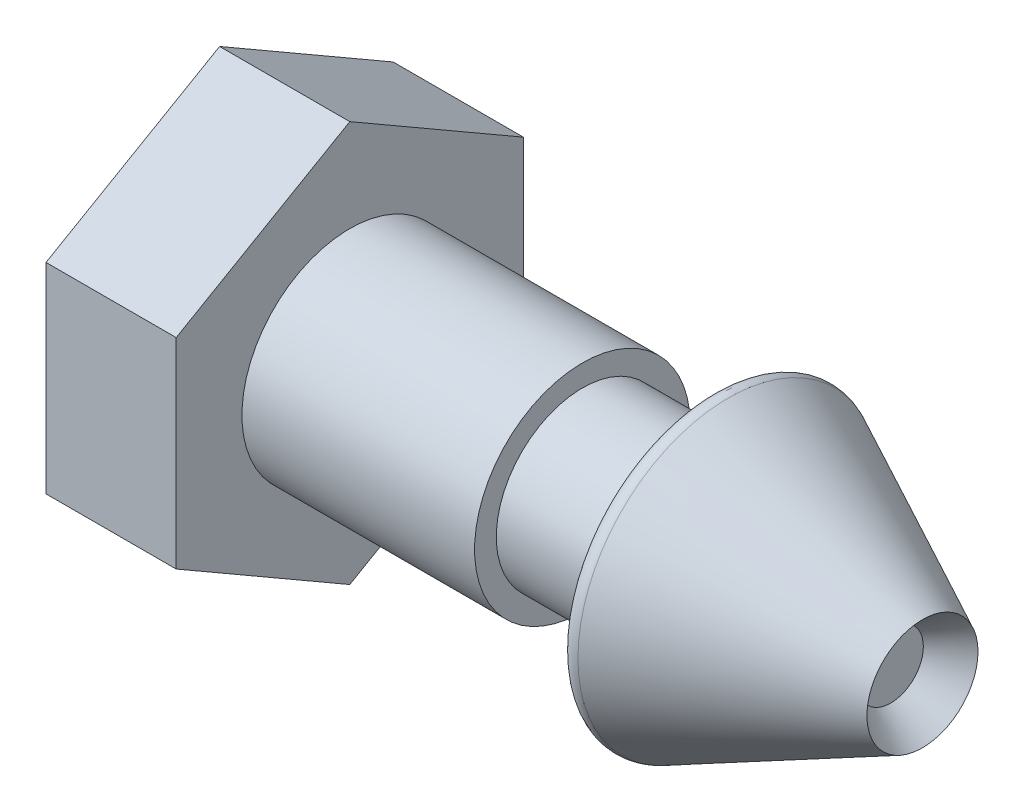
ISO-10303-21;
HEADER;
FILE_DESCRIPTION(('STEP AP214'),'2;1');
FILE_NAME('part.step','',(''),(''),'','','');
FILE_SCHEMA(('AUTOMOTIVE_DESIGN { 1 0 10303 214 1 1 1 1 }'));
ENDSEC;
DATA;
#1=APPLICATION_CONTEXT('core data for automotive mechanical design processes');
#2=APPLICATION_PROTOCOL_DEFINITION('international standard','automotive_design',2000,#1);
#3=PRODUCT_CONTEXT('',#1,'mechanical');
#4=PRODUCT('Part','Part','',(#3));
#5=PRODUCT_RELATED_PRODUCT_CATEGORY('part','',(#4));
#6=PRODUCT_DEFINITION_FORMATION('','',#4);
#7=PRODUCT_DEFINITION_CONTEXT('part definition',#1,'design');
#8=PRODUCT_DEFINITION('design','',#6,#7);
#9=PRODUCT_DEFINITION_SHAPE('','',#8);
#10=(LENGTH_UNIT() NAMED_UNIT(*) SI_UNIT(.MILLI.,.METRE.));
#11=(NAMED_UNIT(*) PLANE_ANGLE_UNIT() SI_UNIT($,.RADIAN.));
#12=(NAMED_UNIT(*) SI_UNIT($,.STERADIAN.) SOLID_ANGLE_UNIT());
#13=UNCERTAINTY_MEASURE_WITH_UNIT(LENGTH_MEASURE(1.E-05),#10,'distance_accuracy_value','');
#14=(GEOMETRIC_REPRESENTATION_CONTEXT(3) GLOBAL_UNCERTAINTY_ASSIGNED_CONTEXT((#13)) GLOBAL_UNIT_ASSIGNED_CONTEXT((#10,
#11,#12)) REPRESENTATION_CONTEXT('',''));
#15=CARTESIAN_POINT('',(0.,0.,0.));
#16=DIRECTION('',(0.,0.,1.));
#17=DIRECTION('',(1.,0.,0.));
#18=AXIS2_PLACEMENT_3D('',#15,#16,#17);
#19=CARTESIAN_POINT('',(24.9310351643006,0.,0.));
#20=DIRECTION('',(1.,0.,0.));
#21=DIRECTION('',(0.,0.,-1.));
#22=AXIS2_PLACEMENT_3D('',#19,#20,#21);
#23=CYLINDRICAL_SURFACE('',#22,4.97);
#24=CARTESIAN_POINT('',(0.,0.,0.));
#25=DIRECTION('',(1.,0.,0.));
#26=DIRECTION('',(0.,0.,-1.));
#27=AXIS2_PLACEMENT_3D('',#24,#25,#26);
#28=CIRCLE('',#27,4.97);
#29=CARTESIAN_POINT('',(0.,0.,-4.97));
#30=VERTEX_POINT('',#29);
#31=EDGE_CURVE('E144',#30,#30,#28,.T.);
#32=ORIENTED_EDGE('',*,*,#31,.T.);
#33=EDGE_LOOP('',(#32));
#34=FACE_BOUND('',#33,.T.);
#35=CARTESIAN_POINT('',(10.72,0.,0.));
#36=DIRECTION('',(1.,0.,0.));
#37=DIRECTION('',(0.,0.,-1.));
#38=AXIS2_PLACEMENT_3D('',#35,#36,#37);
#39=CIRCLE('',#38,4.97);
#40=CARTESIAN_POINT('',(10.72,0.,-4.97));
#41=VERTEX_POINT('',#40);
#42=EDGE_CURVE('E154',#41,#41,#39,.T.);
#43=ORIENTED_EDGE('',*,*,#42,.F.);
#44=EDGE_LOOP('',(#43));
#45=FACE_BOUND('',#44,.T.);
#46=ADVANCED_FACE('F39',(#34,#45),#23,.T.);
#47=CARTESIAN_POINT('',(10.72,4.97,0.));
#48=DIRECTION('',(1.,0.,0.));
#49=DIRECTION('',(0.,0.,-1.));
#50=AXIS2_PLACEMENT_3D('',#47,#48,#49);
#51=PLANE('',#50);
#52=ORIENTED_EDGE('',*,*,#42,.T.);
#53=EDGE_LOOP('',(#52));
#54=FACE_BOUND('',#53,.T.);
#55=CARTESIAN_POINT('',(10.72,0.,0.));
#56=DIRECTION('',(1.,0.,0.));
#57=DIRECTION('',(0.,0.,-1.));
#58=AXIS2_PLACEMENT_3D('',#55,#56,#57);
#59=CIRCLE('',#58,3.97);
#60=CARTESIAN_POINT('',(10.72,0.,-3.97));
#61=VERTEX_POINT('',#60);
#62=EDGE_CURVE('E151',#61,#61,#59,.T.);
#63=ORIENTED_EDGE('',*,*,#62,.F.);
#64=EDGE_LOOP('',(#63));
#65=FACE_BOUND('',#64,.T.);
#66=ADVANCED_FACE('F209',(#54,#65),#51,.T.);
#67=CARTESIAN_POINT('',(24.9310351643006,0.,0.));
#68=DIRECTION('',(1.,0.,0.));
#69=DIRECTION('',(0.,0.,-1.));
#70=AXIS2_PLACEMENT_3D('',#67,#68,#69);
#71=CYLINDRICAL_SURFACE('',#70,3.97);
#72=CARTESIAN_POINT('',(16.22,0.,0.));
#73=DIRECTION('',(-1.,0.,0.));
#74=DIRECTION('',(0.,0.,1.));
#75=AXIS2_PLACEMENT_3D('',#72,#73,#74);
#76=CIRCLE('',#75,3.97);
#77=CARTESIAN_POINT('',(16.22,0.,3.97));
#78=VERTEX_POINT('',#77);
#79=EDGE_CURVE('E48',#78,#78,#76,.T.);
#80=ORIENTED_EDGE('',*,*,#79,.T.);
#81=EDGE_LOOP('',(#80));
#82=FACE_BOUND('',#81,.T.);
#83=ORIENTED_EDGE('',*,*,#62,.T.);
#84=EDGE_LOOP('',(#83));
#85=FACE_BOUND('',#84,.T.);
#86=ADVANCED_FACE('F167',(#82,#85),#71,.T.);
#87=CARTESIAN_POINT('',(16.72,3.97,0.));
#88=DIRECTION('',(-1.,0.,0.));
#89=DIRECTION('',(0.,0.,1.));
#90=AXIS2_PLACEMENT_3D('',#87,#88,#89);
#91=PLANE('',#90);
#92=CARTESIAN_POINT('',(16.72,0.,0.));
#93=DIRECTION('',(-1.,0.,0.));
#94=DIRECTION('',(0.,0.,1.));
#95=AXIS2_PLACEMENT_3D('',#92,#93,#94);
#96=CIRCLE('',#95,4.47);
#97=CARTESIAN_POINT('',(16.72,0.,4.47));
#98=VERTEX_POINT('',#97);
#99=EDGE_CURVE('E162',#98,#98,#96,.F.);
#100=ORIENTED_EDGE('',*,*,#99,.T.);
#101=EDGE_LOOP('',(#100));
#102=FACE_BOUND('',#101,.T.);
#103=CARTESIAN_POINT('',(16.72,0.,0.));
#104=DIRECTION('',(-1.,0.,0.));
#105=DIRECTION('',(0.,0.,1.));
#106=AXIS2_PLACEMENT_3D('',#103,#104,#105);
#107=CIRCLE('',#106,6.47620686691128);
#108=CARTESIAN_POINT('',(16.72,0.,6.47620686691128));
#109=VERTEX_POINT('',#108);
#110=EDGE_CURVE('E157',#109,#109,#107,.T.);
#111=ORIENTED_EDGE('',*,*,#110,.T.);
#112=EDGE_LOOP('',(#111));
#113=FACE_BOUND('',#112,.T.);
#114=ADVANCED_FACE('F176',(#102,#113),#91,.T.);
#115=CARTESIAN_POINT('',(26.39,0.,0.));
#116=DIRECTION('',(-1.,0.,0.));
#117=DIRECTION('',(0.,0.,1.));
#118=AXIS2_PLACEMENT_3D('',#115,#116,#117);
#119=CONICAL_SURFACE('',#118,2.56,0.453785605518519);
#120=CARTESIAN_POINT('',(17.4391855733945,0.,0.));
#121=DIRECTION('',(1.,0.,0.));
#122=DIRECTION('',(0.,0.,-1.));
#123=AXIS2_PLACEMENT_3D('',#120,#121,#122);
#124=CIRCLE('',#123,6.92560389006087);
#125=CARTESIAN_POINT('',(17.4391855733945,0.,-6.92560389006087));
#126=VERTEX_POINT('',#125);
#127=EDGE_CURVE('E11',#126,#126,#124,.T.);
#128=ORIENTED_EDGE('',*,*,#127,.T.);
#129=EDGE_LOOP('',(#128));
#130=FACE_BOUND('',#129,.T.);
#131=CARTESIAN_POINT('',(26.39,0.,0.));
#132=DIRECTION('',(1.,0.,0.));
#133=DIRECTION('',(0.,0.,-1.));
#134=AXIS2_PLACEMENT_3D('',#131,#132,#133);
#135=CIRCLE('',#134,2.56);
#136=CARTESIAN_POINT('',(26.39,0.,-2.56));
#137=VERTEX_POINT('',#136);
#138=EDGE_CURVE('E148',#137,#137,#135,.T.);
#139=ORIENTED_EDGE('',*,*,#138,.F.);
#140=EDGE_LOOP('',(#139));
#141=FACE_BOUND('',#140,.T.);
#142=ADVANCED_FACE('F179',(#130,#141),#119,.T.);
#143=CARTESIAN_POINT('',(24.9310351643006,0.,0.));
#144=DIRECTION('',(1.,0.,0.));
#145=DIRECTION('',(0.,0.,-1.));
#146=AXIS2_PLACEMENT_3D('',#143,#144,#145);
#147=CONICAL_SURFACE('',#146,1.5,0.628318530717961);
#148=ORIENTED_EDGE('',*,*,#138,.T.);
#149=EDGE_LOOP('',(#148));
#150=FACE_BOUND('',#149,.T.);
#151=CARTESIAN_POINT('',(24.9310351643006,0.,0.));
#152=DIRECTION('',(1.,0.,0.));
#153=DIRECTION('',(0.,0.,-1.));
#154=AXIS2_PLACEMENT_3D('',#151,#152,#153);
#155=CIRCLE('',#154,1.5);
#156=CARTESIAN_POINT('',(24.9310351643006,0.,-1.5));
#157=VERTEX_POINT('',#156);
#158=EDGE_CURVE('E145',#157,#157,#155,.T.);
#159=ORIENTED_EDGE('',*,*,#158,.F.);
#160=EDGE_LOOP('',(#159));
#161=FACE_BOUND('',#160,.T.);
#162=ADVANCED_FACE('F189',(#150,#161),#147,.F.);
#163=CARTESIAN_POINT('',(24.9310351643006,1.5,0.));
#164=DIRECTION('',(1.,0.,0.));
#165=DIRECTION('',(0.,0.,-1.));
#166=AXIS2_PLACEMENT_3D('',#163,#164,#165);
#167=PLANE('',#166);
#168=ORIENTED_EDGE('',*,*,#158,.T.);
#169=EDGE_LOOP('',(#168));
#170=FACE_BOUND('',#169,.T.);
#171=ADVANCED_FACE('F195',(#170),#167,.T.);
#172=CARTESIAN_POINT('',(-6.,4.61880215351701,8.));
#173=DIRECTION('',(0.,-0.866025403784439,-0.5));
#174=DIRECTION('',(0.,0.5,-0.866025403784439));
#175=AXIS2_PLACEMENT_3D('',#172,#173,#174);
#176=PLANE('',#175);
#177=DIRECTION('',(0.,0.5,-0.866025403784439));
#178=VECTOR('',#177,1.);
#179=CARTESIAN_POINT('',(0.,4.61880215351701,8.));
#180=LINE('',#179,#178);
#181=CARTESIAN_POINT('',(0.,4.61880215351701,8.));
#182=VERTEX_POINT('',#181);
#183=CARTESIAN_POINT('',(0.,9.23760430703401,0.));
#184=VERTEX_POINT('',#183);
#185=EDGE_CURVE('E125',#182,#184,#180,.T.);
#186=ORIENTED_EDGE('',*,*,#185,.T.);
#187=DIRECTION('',(1.,0.,0.));
#188=VECTOR('',#187,1.);
#189=CARTESIAN_POINT('',(-6.,9.23760430703401,0.));
#190=LINE('',#189,#188);
#191=CARTESIAN_POINT('',(-6.,9.23760430703401,0.));
#192=VERTEX_POINT('',#191);
#193=EDGE_CURVE('E142',#192,#184,#190,.T.);
#194=ORIENTED_EDGE('',*,*,#193,.F.);
#195=DIRECTION('',(0.,0.5,-0.866025403784439));
#196=VECTOR('',#195,1.);
#197=CARTESIAN_POINT('',(-6.,4.61880215351701,8.));
#198=LINE('',#197,#196);
#199=CARTESIAN_POINT('',(-6.,4.61880215351701,8.));
#200=VERTEX_POINT('',#199);
#201=EDGE_CURVE('E135',#200,#192,#198,.T.);
#202=ORIENTED_EDGE('',*,*,#201,.F.);
#203=DIRECTION('',(1.,0.,0.));
#204=VECTOR('',#203,1.);
#205=CARTESIAN_POINT('',(-6.,4.61880215351701,8.));
#206=LINE('',#205,#204);
#207=EDGE_CURVE('E121',#200,#182,#206,.T.);
#208=ORIENTED_EDGE('',*,*,#207,.T.);
#209=EDGE_LOOP('',(#186,#194,#202,#208));
#210=FACE_BOUND('',#209,.T.);
#211=ADVANCED_FACE('F200',(#210),#176,.F.);
#212=CARTESIAN_POINT('',(-6.,9.23760430703401,0.));
#213=DIRECTION('',(0.,-0.866025403784439,0.5));
#214=DIRECTION('',(0.,-0.5,-0.866025403784439));
#215=AXIS2_PLACEMENT_3D('',#212,#213,#214);
#216=PLANE('',#215);
#217=DIRECTION('',(0.,-0.5,-0.866025403784438));
#218=VECTOR('',#217,1.);
#219=CARTESIAN_POINT('',(0.,9.23760430703401,0.));
#220=LINE('',#219,#218);
#221=CARTESIAN_POINT('',(0.,4.618802153517,-8.));
#222=VERTEX_POINT('',#221);
#223=EDGE_CURVE('E128',#184,#222,#220,.T.);
#224=ORIENTED_EDGE('',*,*,#223,.T.);
#225=DIRECTION('',(1.,0.,0.));
#226=VECTOR('',#225,1.);
#227=CARTESIAN_POINT('',(-6.,4.618802153517,-8.));
#228=LINE('',#227,#226);
#229=CARTESIAN_POINT('',(-6.,4.618802153517,-8.));
#230=VERTEX_POINT('',#229);
#231=EDGE_CURVE('E139',#230,#222,#228,.T.);
#232=ORIENTED_EDGE('',*,*,#231,.F.);
#233=DIRECTION('',(0.,-0.5,-0.866025403784438));
#234=VECTOR('',#233,1.);
#235=CARTESIAN_POINT('',(-6.,9.23760430703401,0.));
#236=LINE('',#235,#234);
#237=EDGE_CURVE('E94',#192,#230,#236,.T.);
#238=ORIENTED_EDGE('',*,*,#237,.F.);
#239=ORIENTED_EDGE('',*,*,#193,.T.);
#240=EDGE_LOOP('',(#224,#232,#238,#239));
#241=FACE_BOUND('',#240,.T.);
#242=ADVANCED_FACE('F205',(#241),#216,.F.);
#243=CARTESIAN_POINT('',(-6.,4.618802153517,-8.));
#244=DIRECTION('',(0.,0.,1.));
#245=DIRECTION('',(0.,-1.,0.));
#246=AXIS2_PLACEMENT_3D('',#243,#244,#245);
#247=PLANE('',#246);
#248=DIRECTION('',(0.,-1.,0.));
#249=VECTOR('',#248,1.);
#250=CARTESIAN_POINT('',(0.,4.618802153517,-8.));
#251=LINE('',#250,#249);
#252=CARTESIAN_POINT('',(0.,-4.61880215351701,-8.));
#253=VERTEX_POINT('',#252);
#254=EDGE_CURVE('E130',#222,#253,#251,.T.);
#255=ORIENTED_EDGE('',*,*,#254,.T.);
#256=DIRECTION('',(1.,0.,0.));
#257=VECTOR('',#256,1.);
#258=CARTESIAN_POINT('',(-6.,-4.61880215351701,-8.));
#259=LINE('',#258,#257);
#260=CARTESIAN_POINT('',(-6.,-4.61880215351701,-8.));
#261=VERTEX_POINT('',#260);
#262=EDGE_CURVE('E116',#261,#253,#259,.T.);
#263=ORIENTED_EDGE('',*,*,#262,.F.);
#264=DIRECTION('',(0.,-1.,0.));
#265=VECTOR('',#264,1.);
#266=CARTESIAN_POINT('',(-6.,4.618802153517,-8.));
#267=LINE('',#266,#265);
#268=EDGE_CURVE('E107',#230,#261,#267,.T.);
#269=ORIENTED_EDGE('',*,*,#268,.F.);
#270=ORIENTED_EDGE('',*,*,#231,.T.);
#271=EDGE_LOOP('',(#255,#263,#269,#270));
#272=FACE_BOUND('',#271,.T.);
#273=ADVANCED_FACE('F285',(#272),#247,.F.);
#274=CARTESIAN_POINT('',(-6.,-4.61880215351701,-8.));
#275=DIRECTION('',(0.,0.866025403784439,0.5));
#276=DIRECTION('',(0.,-0.5,0.866025403784439));
#277=AXIS2_PLACEMENT_3D('',#274,#275,#276);
#278=PLANE('',#277);
#279=DIRECTION('',(0.,-0.5,0.866025403784439));
#280=VECTOR('',#279,1.);
#281=CARTESIAN_POINT('',(0.,-4.61880215351701,-8.));
#282=LINE('',#281,#280);
#283=CARTESIAN_POINT('',(0.,-9.23760430703401,0.));
#284=VERTEX_POINT('',#283);
#285=EDGE_CURVE('E115',#253,#284,#282,.T.);
#286=ORIENTED_EDGE('',*,*,#285,.T.);
#287=DIRECTION('',(1.,0.,0.));
#288=VECTOR('',#287,1.);
#289=CARTESIAN_POINT('',(-6.,-9.23760430703401,0.));
#290=LINE('',#289,#288);
#291=CARTESIAN_POINT('',(-6.,-9.23760430703401,0.));
#292=VERTEX_POINT('',#291);
#293=EDGE_CURVE('E112',#292,#284,#290,.T.);
#294=ORIENTED_EDGE('',*,*,#293,.F.);
#295=DIRECTION('',(0.,-0.5,0.866025403784439));
#296=VECTOR('',#295,1.);
#297=CARTESIAN_POINT('',(-6.,-4.61880215351701,-8.));
#298=LINE('',#297,#296);
#299=EDGE_CURVE('E101',#261,#292,#298,.T.);
#300=ORIENTED_EDGE('',*,*,#299,.F.);
#301=ORIENTED_EDGE('',*,*,#262,.T.);
#302=EDGE_LOOP('',(#286,#294,#300,#301));
#303=FACE_BOUND('',#302,.T.);
#304=ADVANCED_FACE('F113',(#303),#278,.F.);
#305=CARTESIAN_POINT('',(-6.,-9.23760430703401,0.));
#306=DIRECTION('',(0.,0.866025403784438,-0.5));
#307=DIRECTION('',(0.,0.5,0.866025403784439));
#308=AXIS2_PLACEMENT_3D('',#305,#306,#307);
#309=PLANE('',#308);
#310=DIRECTION('',(0.,0.5,0.866025403784439));
#311=VECTOR('',#310,1.);
#312=CARTESIAN_POINT('',(0.,-9.23760430703401,0.));
#313=LINE('',#312,#311);
#314=CARTESIAN_POINT('',(0.,-4.61880215351701,8.));
#315=VERTEX_POINT('',#314);
#316=EDGE_CURVE('E79',#284,#315,#313,.T.);
#317=ORIENTED_EDGE('',*,*,#316,.T.);
#318=DIRECTION('',(1.,0.,0.));
#319=VECTOR('',#318,1.);
#320=CARTESIAN_POINT('',(-6.,-4.61880215351701,8.));
#321=LINE('',#320,#319);
#322=CARTESIAN_POINT('',(-6.,-4.61880215351701,8.));
#323=VERTEX_POINT('',#322);
#324=EDGE_CURVE('E117',#323,#315,#321,.T.);
#325=ORIENTED_EDGE('',*,*,#324,.F.);
#326=DIRECTION('',(0.,0.5,0.866025403784439));
#327=VECTOR('',#326,1.);
#328=CARTESIAN_POINT('',(-6.,-9.23760430703401,0.));
#329=LINE('',#328,#327);
#330=EDGE_CURVE('E105',#292,#323,#329,.T.);
#331=ORIENTED_EDGE('',*,*,#330,.F.);
#332=ORIENTED_EDGE('',*,*,#293,.T.);
#333=EDGE_LOOP('',(#317,#325,#331,#332));
#334=FACE_BOUND('',#333,.T.);
#335=ADVANCED_FACE('F119',(#334),#309,.F.);
#336=CARTESIAN_POINT('',(-6.,-4.61880215351701,8.));
#337=DIRECTION('',(0.,0.,-1.));
#338=DIRECTION('',(0.,1.,0.));
#339=AXIS2_PLACEMENT_3D('',#336,#337,#338);
#340=PLANE('',#339);
#341=DIRECTION('',(0.,1.,0.));
#342=VECTOR('',#341,1.);
#343=CARTESIAN_POINT('',(0.,-4.61880215351701,8.));
#344=LINE('',#343,#342);
#345=EDGE_CURVE('E85',#315,#182,#344,.T.);
#346=ORIENTED_EDGE('',*,*,#345,.T.);
#347=ORIENTED_EDGE('',*,*,#207,.F.);
#348=DIRECTION('',(0.,1.,0.));
#349=VECTOR('',#348,1.);
#350=CARTESIAN_POINT('',(-6.,-4.61880215351701,8.));
#351=LINE('',#350,#349);
#352=EDGE_CURVE('E56',#323,#200,#351,.T.);
#353=ORIENTED_EDGE('',*,*,#352,.F.);
#354=ORIENTED_EDGE('',*,*,#324,.T.);
#355=EDGE_LOOP('',(#346,#347,#353,#354));
#356=FACE_BOUND('',#355,.T.);
#357=ADVANCED_FACE('F263',(#356),#340,.F.);
#358=CARTESIAN_POINT('',(-6.,0.,0.));
#359=DIRECTION('',(-1.,0.,0.));
#360=DIRECTION('',(0.,0.,1.));
#361=AXIS2_PLACEMENT_3D('',#358,#359,#360);
#362=PLANE('',#361);
#363=ORIENTED_EDGE('',*,*,#201,.T.);
#364=ORIENTED_EDGE('',*,*,#237,.T.);
#365=ORIENTED_EDGE('',*,*,#268,.T.);
#366=ORIENTED_EDGE('',*,*,#299,.T.);
#367=ORIENTED_EDGE('',*,*,#330,.T.);
#368=ORIENTED_EDGE('',*,*,#352,.T.);
#369=EDGE_LOOP('',(#363,#364,#365,#366,#367,#368));
#370=FACE_BOUND('',#369,.T.);
#371=ADVANCED_FACE('F103',(#370),#362,.T.);
#372=CARTESIAN_POINT('',(0.,0.,0.));
#373=DIRECTION('',(-1.,0.,0.));
#374=DIRECTION('',(0.,0.,1.));
#375=AXIS2_PLACEMENT_3D('',#372,#373,#374);
#376=PLANE('',#375);
#377=ORIENTED_EDGE('',*,*,#31,.F.);
#378=EDGE_LOOP('',(#377));
#379=FACE_BOUND('',#378,.T.);
#380=ORIENTED_EDGE('',*,*,#185,.F.);
#381=ORIENTED_EDGE('',*,*,#345,.F.);
#382=ORIENTED_EDGE('',*,*,#316,.F.);
#383=ORIENTED_EDGE('',*,*,#285,.F.);
#384=ORIENTED_EDGE('',*,*,#254,.F.);
#385=ORIENTED_EDGE('',*,*,#223,.F.);
#386=EDGE_LOOP('',(#380,#381,#382,#383,#384,#385));
#387=FACE_BOUND('',#386,.T.);
#388=ADVANCED_FACE('F173',(#379,#387),#376,.F.);
#389=CARTESIAN_POINT('',(16.22,0.,0.));
#390=DIRECTION('',(-1.,0.,0.));
#391=DIRECTION('',(0.,0.,1.));
#392=AXIS2_PLACEMENT_3D('',#389,#390,#391);
#393=TOROIDAL_SURFACE('',#392,4.47,0.5);
#394=ORIENTED_EDGE('',*,*,#79,.F.);
#395=EDGE_LOOP('',(#394));
#396=FACE_BOUND('',#395,.T.);
#397=ORIENTED_EDGE('',*,*,#99,.F.);
#398=EDGE_LOOP('',(#397));
#399=FACE_BOUND('',#398,.T.);
#400=ADVANCED_FACE('F170',(#396,#399),#393,.F.);
#401=CARTESIAN_POINT('',(17.22,0.,0.));
#402=DIRECTION('',(-1.,0.,0.));
#403=DIRECTION('',(0.,0.,1.));
#404=AXIS2_PLACEMENT_3D('',#401,#402,#403);
#405=TOROIDAL_SURFACE('',#404,6.47620686691128,0.5);
#406=ORIENTED_EDGE('',*,*,#110,.F.);
#407=EDGE_LOOP('',(#406));
#408=FACE_BOUND('',#407,.T.);
#409=ORIENTED_EDGE('',*,*,#127,.F.);
#410=EDGE_LOOP('',(#409));
#411=FACE_BOUND('',#410,.T.);
#412=ADVANCED_FACE('F41',(#408,#411),#405,.T.);
#413=CLOSED_SHELL('',(#46,#66,#86,#114,#142,#162,#171,#211,#242,#273,#304,#335,#357,#371,#388,
#400,#412));
#414=MANIFOLD_SOLID_BREP('B2',#413);
#415=ADVANCED_BREP_SHAPE_REPRESENTATION('',(#18,#414),#14);
#416=SHAPE_DEFINITION_REPRESENTATION(#9,#415);
ENDSEC;
END-ISO-10303-21;
